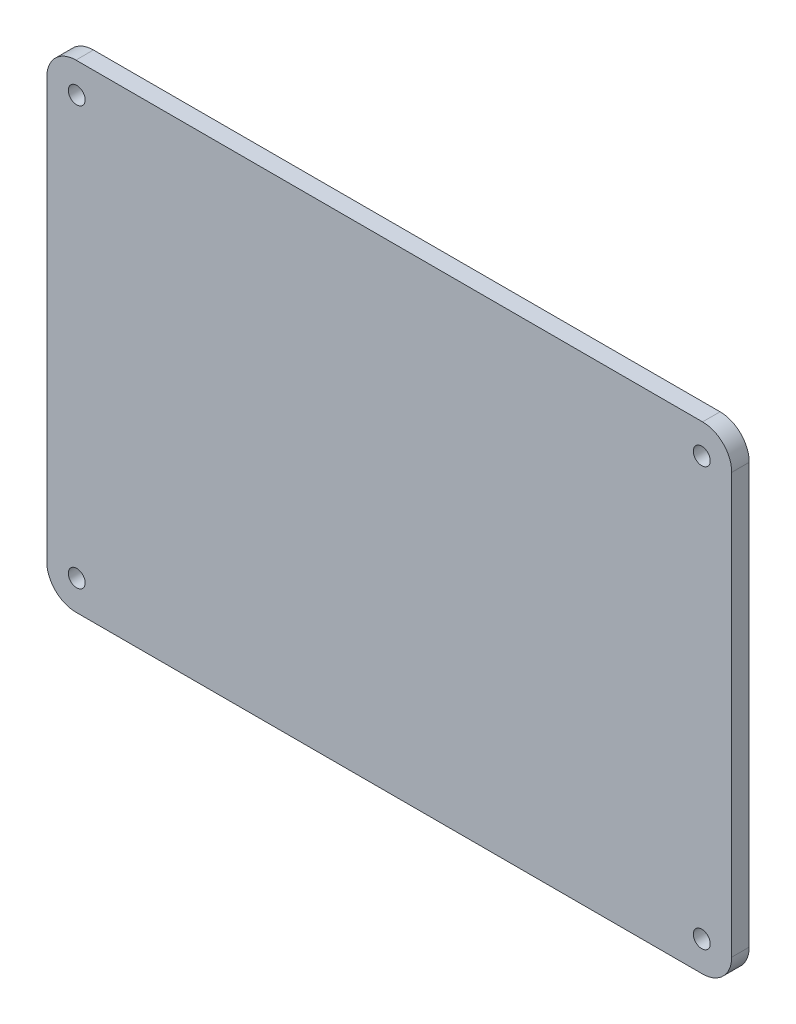
ISO-10303-21;
HEADER;
FILE_DESCRIPTION(('STEP AP214'),'2;1');
FILE_NAME('part.step','',(''),(''),'','','');
FILE_SCHEMA(('AUTOMOTIVE_DESIGN { 1 0 10303 214 1 1 1 1 }'));
ENDSEC;
DATA;
#1=APPLICATION_CONTEXT('core data for automotive mechanical design processes');
#2=APPLICATION_PROTOCOL_DEFINITION('international standard','automotive_design',2000,#1);
#3=PRODUCT_CONTEXT('',#1,'mechanical');
#4=PRODUCT('Part','Part','',(#3));
#5=PRODUCT_RELATED_PRODUCT_CATEGORY('part','',(#4));
#6=PRODUCT_DEFINITION_FORMATION('','',#4);
#7=PRODUCT_DEFINITION_CONTEXT('part definition',#1,'design');
#8=PRODUCT_DEFINITION('design','',#6,#7);
#9=PRODUCT_DEFINITION_SHAPE('','',#8);
#10=(LENGTH_UNIT() NAMED_UNIT(*) SI_UNIT(.MILLI.,.METRE.));
#11=(NAMED_UNIT(*) PLANE_ANGLE_UNIT() SI_UNIT($,.RADIAN.));
#12=(NAMED_UNIT(*) SI_UNIT($,.STERADIAN.) SOLID_ANGLE_UNIT());
#13=UNCERTAINTY_MEASURE_WITH_UNIT(LENGTH_MEASURE(1.E-05),#10,'distance_accuracy_value','');
#14=(GEOMETRIC_REPRESENTATION_CONTEXT(3) GLOBAL_UNCERTAINTY_ASSIGNED_CONTEXT((#13)) GLOBAL_UNIT_ASSIGNED_CONTEXT((#10,
#11,#12)) REPRESENTATION_CONTEXT('',''));
#15=CARTESIAN_POINT('',(0.,0.,0.));
#16=DIRECTION('',(0.,0.,1.));
#17=DIRECTION('',(1.,0.,0.));
#18=AXIS2_PLACEMENT_3D('',#15,#16,#17);
#19=CARTESIAN_POINT('',(-700.529573215545,903.661404474546,3.));
#20=DIRECTION('',(0.,0.,-1.));
#21=DIRECTION('',(-1.,0.,0.));
#22=AXIS2_PLACEMENT_3D('',#19,#20,#21);
#23=CYLINDRICAL_SURFACE('',#22,5.00000000000061);
#24=CARTESIAN_POINT('',(-700.529573215545,903.661404474546,0.));
#25=DIRECTION('',(0.,0.,1.));
#26=DIRECTION('',(1.,0.,0.));
#27=AXIS2_PLACEMENT_3D('',#24,#25,#26);
#28=CIRCLE('',#27,5.00000000000061);
#29=CARTESIAN_POINT('',(-700.529573215546,908.661404474546,0.));
#30=VERTEX_POINT('',#29);
#31=CARTESIAN_POINT('',(-705.529573215546,903.661404474546,0.));
#32=VERTEX_POINT('',#31);
#33=EDGE_CURVE('E135',#30,#32,#28,.T.);
#34=ORIENTED_EDGE('',*,*,#33,.T.);
#35=DIRECTION('',(0.,0.,-1.));
#36=VECTOR('',#35,1.);
#37=CARTESIAN_POINT('',(-705.529573215546,903.661404474546,3.));
#38=LINE('',#37,#36);
#39=CARTESIAN_POINT('',(-705.529573215546,903.661404474546,3.));
#40=VERTEX_POINT('',#39);
#41=EDGE_CURVE('E11',#40,#32,#38,.T.);
#42=ORIENTED_EDGE('',*,*,#41,.F.);
#43=CARTESIAN_POINT('',(-700.529573215545,903.661404474546,3.));
#44=DIRECTION('',(0.,0.,1.));
#45=DIRECTION('',(1.,0.,0.));
#46=AXIS2_PLACEMENT_3D('',#43,#44,#45);
#47=CIRCLE('',#46,5.00000000000061);
#48=CARTESIAN_POINT('',(-700.529573215546,908.661404474546,3.));
#49=VERTEX_POINT('',#48);
#50=EDGE_CURVE('E150',#49,#40,#47,.T.);
#51=ORIENTED_EDGE('',*,*,#50,.F.);
#52=DIRECTION('',(0.,0.,-1.));
#53=VECTOR('',#52,1.);
#54=CARTESIAN_POINT('',(-700.529573215546,908.661404474546,3.));
#55=LINE('',#54,#53);
#56=EDGE_CURVE('E131',#49,#30,#55,.T.);
#57=ORIENTED_EDGE('',*,*,#56,.T.);
#58=EDGE_LOOP('',(#34,#42,#51,#57));
#59=FACE_BOUND('',#58,.T.);
#60=ADVANCED_FACE('F39',(#59),#23,.T.);
#61=CARTESIAN_POINT('',(-705.529573215546,831.660004474546,3.));
#62=DIRECTION('',(1.,0.,0.));
#63=DIRECTION('',(0.,0.,-1.));
#64=AXIS2_PLACEMENT_3D('',#61,#62,#63);
#65=PLANE('',#64);
#66=DIRECTION('',(0.,-1.,0.));
#67=VECTOR('',#66,1.);
#68=CARTESIAN_POINT('',(-705.529573215546,831.660004474546,0.));
#69=LINE('',#68,#67);
#70=CARTESIAN_POINT('',(-705.529573215546,831.660004474546,0.));
#71=VERTEX_POINT('',#70);
#72=EDGE_CURVE('E138',#32,#71,#69,.T.);
#73=ORIENTED_EDGE('',*,*,#72,.T.);
#74=DIRECTION('',(0.,0.,-1.));
#75=VECTOR('',#74,1.);
#76=CARTESIAN_POINT('',(-705.529573215546,831.660004474546,3.));
#77=LINE('',#76,#75);
#78=CARTESIAN_POINT('',(-705.529573215546,831.660004474546,3.));
#79=VERTEX_POINT('',#78);
#80=EDGE_CURVE('E47',#79,#71,#77,.T.);
#81=ORIENTED_EDGE('',*,*,#80,.F.);
#82=DIRECTION('',(0.,-1.,0.));
#83=VECTOR('',#82,1.);
#84=CARTESIAN_POINT('',(-705.529573215546,831.660004474546,3.));
#85=LINE('',#84,#83);
#86=EDGE_CURVE('E98',#40,#79,#85,.T.);
#87=ORIENTED_EDGE('',*,*,#86,.F.);
#88=ORIENTED_EDGE('',*,*,#41,.T.);
#89=EDGE_LOOP('',(#73,#81,#87,#88));
#90=FACE_BOUND('',#89,.T.);
#91=ADVANCED_FACE('F235',(#90),#65,.F.);
#92=CARTESIAN_POINT('',(-700.529573215546,831.660004474546,3.));
#93=DIRECTION('',(0.,0.,-1.));
#94=DIRECTION('',(-1.,0.,0.));
#95=AXIS2_PLACEMENT_3D('',#92,#93,#94);
#96=CYLINDRICAL_SURFACE('',#95,4.99999999999978);
#97=CARTESIAN_POINT('',(-700.529573215546,831.660004474546,0.));
#98=DIRECTION('',(0.,0.,1.));
#99=DIRECTION('',(1.,0.,0.));
#100=AXIS2_PLACEMENT_3D('',#97,#98,#99);
#101=CIRCLE('',#100,4.99999999999978);
#102=CARTESIAN_POINT('',(-700.529573215546,826.660004474546,0.));
#103=VERTEX_POINT('',#102);
#104=EDGE_CURVE('E141',#71,#103,#101,.T.);
#105=ORIENTED_EDGE('',*,*,#104,.T.);
#106=DIRECTION('',(0.,0.,-1.));
#107=VECTOR('',#106,1.);
#108=CARTESIAN_POINT('',(-700.529573215546,826.660004474546,3.));
#109=LINE('',#108,#107);
#110=CARTESIAN_POINT('',(-700.529573215546,826.660004474546,3.));
#111=VERTEX_POINT('',#110);
#112=EDGE_CURVE('E157',#111,#103,#109,.T.);
#113=ORIENTED_EDGE('',*,*,#112,.F.);
#114=CARTESIAN_POINT('',(-700.529573215546,831.660004474546,3.));
#115=DIRECTION('',(0.,0.,1.));
#116=DIRECTION('',(1.,0.,0.));
#117=AXIS2_PLACEMENT_3D('',#114,#115,#116);
#118=CIRCLE('',#117,4.99999999999978);
#119=EDGE_CURVE('E165',#79,#111,#118,.T.);
#120=ORIENTED_EDGE('',*,*,#119,.F.);
#121=ORIENTED_EDGE('',*,*,#80,.T.);
#122=EDGE_LOOP('',(#105,#113,#120,#121));
#123=FACE_BOUND('',#122,.T.);
#124=ADVANCED_FACE('F163',(#123),#96,.T.);
#125=CARTESIAN_POINT('',(-700.529573215546,826.660004474546,3.));
#126=DIRECTION('',(0.,1.,0.));
#127=DIRECTION('',(-1.,0.,0.));
#128=AXIS2_PLACEMENT_3D('',#125,#126,#127);
#129=PLANE('',#128);
#130=DIRECTION('',(1.,0.,0.));
#131=VECTOR('',#130,1.);
#132=CARTESIAN_POINT('',(-700.529573215546,826.660004474546,0.));
#133=LINE('',#132,#131);
#134=CARTESIAN_POINT('',(-593.069773215546,826.660004474546,0.));
#135=VERTEX_POINT('',#134);
#136=EDGE_CURVE('E143',#103,#135,#133,.T.);
#137=ORIENTED_EDGE('',*,*,#136,.T.);
#138=DIRECTION('',(0.,0.,-1.));
#139=VECTOR('',#138,1.);
#140=CARTESIAN_POINT('',(-593.069773215546,826.660004474546,3.));
#141=LINE('',#140,#139);
#142=CARTESIAN_POINT('',(-593.069773215546,826.660004474546,3.));
#143=VERTEX_POINT('',#142);
#144=EDGE_CURVE('E154',#143,#135,#141,.T.);
#145=ORIENTED_EDGE('',*,*,#144,.F.);
#146=DIRECTION('',(1.,0.,0.));
#147=VECTOR('',#146,1.);
#148=CARTESIAN_POINT('',(-700.529573215546,826.660004474546,3.));
#149=LINE('',#148,#147);
#150=EDGE_CURVE('E177',#111,#143,#149,.T.);
#151=ORIENTED_EDGE('',*,*,#150,.F.);
#152=ORIENTED_EDGE('',*,*,#112,.T.);
#153=EDGE_LOOP('',(#137,#145,#151,#152));
#154=FACE_BOUND('',#153,.T.);
#155=ADVANCED_FACE('F173',(#154),#129,.F.);
#156=CARTESIAN_POINT('',(-593.069773215546,831.660004474546,3.));
#157=DIRECTION('',(0.,0.,-1.));
#158=DIRECTION('',(-1.,0.,0.));
#159=AXIS2_PLACEMENT_3D('',#156,#157,#158);
#160=CYLINDRICAL_SURFACE('',#159,4.99999999999967);
#161=CARTESIAN_POINT('',(-593.069773215546,831.660004474546,0.));
#162=DIRECTION('',(0.,0.,1.));
#163=DIRECTION('',(-1.,0.,0.));
#164=AXIS2_PLACEMENT_3D('',#161,#162,#163);
#165=CIRCLE('',#164,4.99999999999967);
#166=CARTESIAN_POINT('',(-588.069773215546,831.660004474546,0.));
#167=VERTEX_POINT('',#166);
#168=EDGE_CURVE('E145',#135,#167,#165,.T.);
#169=ORIENTED_EDGE('',*,*,#168,.T.);
#170=DIRECTION('',(0.,0.,-1.));
#171=VECTOR('',#170,1.);
#172=CARTESIAN_POINT('',(-588.069773215546,831.660004474546,3.));
#173=LINE('',#172,#171);
#174=CARTESIAN_POINT('',(-588.069773215546,831.660004474546,3.));
#175=VERTEX_POINT('',#174);
#176=EDGE_CURVE('E126',#175,#167,#173,.T.);
#177=ORIENTED_EDGE('',*,*,#176,.F.);
#178=CARTESIAN_POINT('',(-593.069773215546,831.660004474546,3.));
#179=DIRECTION('',(0.,0.,1.));
#180=DIRECTION('',(-1.,0.,0.));
#181=AXIS2_PLACEMENT_3D('',#178,#179,#180);
#182=CIRCLE('',#181,4.99999999999967);
#183=EDGE_CURVE('E117',#143,#175,#182,.T.);
#184=ORIENTED_EDGE('',*,*,#183,.F.);
#185=ORIENTED_EDGE('',*,*,#144,.T.);
#186=EDGE_LOOP('',(#169,#177,#184,#185));
#187=FACE_BOUND('',#186,.T.);
#188=ADVANCED_FACE('F176',(#187),#160,.T.);
#189=CARTESIAN_POINT('',(-588.069773215546,903.661404474546,3.));
#190=DIRECTION('',(-1.,0.,0.));
#191=DIRECTION('',(0.,0.,1.));
#192=AXIS2_PLACEMENT_3D('',#189,#190,#191);
#193=PLANE('',#192);
#194=DIRECTION('',(0.,1.,0.));
#195=VECTOR('',#194,1.);
#196=CARTESIAN_POINT('',(-588.069773215546,903.661404474546,0.));
#197=LINE('',#196,#195);
#198=CARTESIAN_POINT('',(-588.069773215546,903.661404474546,0.));
#199=VERTEX_POINT('',#198);
#200=EDGE_CURVE('E125',#167,#199,#197,.T.);
#201=ORIENTED_EDGE('',*,*,#200,.T.);
#202=DIRECTION('',(0.,0.,-1.));
#203=VECTOR('',#202,1.);
#204=CARTESIAN_POINT('',(-588.069773215546,903.661404474546,3.));
#205=LINE('',#204,#203);
#206=CARTESIAN_POINT('',(-588.069773215546,903.661404474546,3.));
#207=VERTEX_POINT('',#206);
#208=EDGE_CURVE('E122',#207,#199,#205,.T.);
#209=ORIENTED_EDGE('',*,*,#208,.F.);
#210=DIRECTION('',(0.,1.,0.));
#211=VECTOR('',#210,1.);
#212=CARTESIAN_POINT('',(-588.069773215546,903.661404474546,3.));
#213=LINE('',#212,#211);
#214=EDGE_CURVE('E111',#175,#207,#213,.T.);
#215=ORIENTED_EDGE('',*,*,#214,.F.);
#216=ORIENTED_EDGE('',*,*,#176,.T.);
#217=EDGE_LOOP('',(#201,#209,#215,#216));
#218=FACE_BOUND('',#217,.T.);
#219=ADVANCED_FACE('F123',(#218),#193,.F.);
#220=CARTESIAN_POINT('',(-593.069773215546,903.661404474546,3.));
#221=DIRECTION('',(0.,0.,-1.));
#222=DIRECTION('',(-1.,0.,0.));
#223=AXIS2_PLACEMENT_3D('',#220,#221,#222);
#224=CYLINDRICAL_SURFACE('',#223,5.00000000000039);
#225=CARTESIAN_POINT('',(-593.069773215546,903.661404474546,0.));
#226=DIRECTION('',(0.,0.,1.));
#227=DIRECTION('',(-1.,0.,0.));
#228=AXIS2_PLACEMENT_3D('',#225,#226,#227);
#229=CIRCLE('',#228,5.00000000000039);
#230=CARTESIAN_POINT('',(-593.069773215546,908.661404474546,0.));
#231=VERTEX_POINT('',#230);
#232=EDGE_CURVE('E84',#199,#231,#229,.T.);
#233=ORIENTED_EDGE('',*,*,#232,.T.);
#234=DIRECTION('',(0.,0.,-1.));
#235=VECTOR('',#234,1.);
#236=CARTESIAN_POINT('',(-593.069773215546,908.661404474546,3.));
#237=LINE('',#236,#235);
#238=CARTESIAN_POINT('',(-593.069773215546,908.661404474546,3.));
#239=VERTEX_POINT('',#238);
#240=EDGE_CURVE('E127',#239,#231,#237,.T.);
#241=ORIENTED_EDGE('',*,*,#240,.F.);
#242=CARTESIAN_POINT('',(-593.069773215546,903.661404474546,3.));
#243=DIRECTION('',(0.,0.,1.));
#244=DIRECTION('',(-1.,0.,0.));
#245=AXIS2_PLACEMENT_3D('',#242,#243,#244);
#246=CIRCLE('',#245,5.00000000000039);
#247=EDGE_CURVE('E115',#207,#239,#246,.T.);
#248=ORIENTED_EDGE('',*,*,#247,.F.);
#249=ORIENTED_EDGE('',*,*,#208,.T.);
#250=EDGE_LOOP('',(#233,#241,#248,#249));
#251=FACE_BOUND('',#250,.T.);
#252=ADVANCED_FACE('F129',(#251),#224,.T.);
#253=CARTESIAN_POINT('',(-700.529573215546,908.661404474546,3.));
#254=DIRECTION('',(0.,-1.,0.));
#255=DIRECTION('',(1.,0.,0.));
#256=AXIS2_PLACEMENT_3D('',#253,#254,#255);
#257=PLANE('',#256);
#258=DIRECTION('',(-1.,0.,0.));
#259=VECTOR('',#258,1.);
#260=CARTESIAN_POINT('',(-700.529573215546,908.661404474546,0.));
#261=LINE('',#260,#259);
#262=EDGE_CURVE('E90',#231,#30,#261,.T.);
#263=ORIENTED_EDGE('',*,*,#262,.T.);
#264=ORIENTED_EDGE('',*,*,#56,.F.);
#265=DIRECTION('',(-1.,0.,0.));
#266=VECTOR('',#265,1.);
#267=CARTESIAN_POINT('',(-700.529573215546,908.661404474546,3.));
#268=LINE('',#267,#266);
#269=EDGE_CURVE('E55',#239,#49,#268,.T.);
#270=ORIENTED_EDGE('',*,*,#269,.F.);
#271=ORIENTED_EDGE('',*,*,#240,.T.);
#272=EDGE_LOOP('',(#263,#264,#270,#271));
#273=FACE_BOUND('',#272,.T.);
#274=ADVANCED_FACE('F211',(#273),#257,.F.);
#275=CARTESIAN_POINT('',(-700.529573215545,903.661404474546,3.));
#276=DIRECTION('',(0.,0.,1.));
#277=DIRECTION('',(1.,0.,0.));
#278=AXIS2_PLACEMENT_3D('',#275,#276,#277);
#279=PLANE('',#278);
#280=CARTESIAN_POINT('',(-700.393534246225,903.525365505225,3.));
#281=DIRECTION('',(0.,0.,1.));
#282=DIRECTION('',(1.,0.,0.));
#283=AXIS2_PLACEMENT_3D('',#280,#281,#282);
#284=CIRCLE('',#283,1.44999999999995);
#285=CARTESIAN_POINT('',(-698.943534246225,903.525365505225,3.));
#286=VERTEX_POINT('',#285);
#287=EDGE_CURVE('E203',#286,#286,#284,.T.);
#288=ORIENTED_EDGE('',*,*,#287,.F.);
#289=EDGE_LOOP('',(#288));
#290=FACE_BOUND('',#289,.T.);
#291=CARTESIAN_POINT('',(-593.205812184867,903.525365505225,3.));
#292=DIRECTION('',(0.,0.,1.));
#293=DIRECTION('',(1.,0.,0.));
#294=AXIS2_PLACEMENT_3D('',#291,#292,#293);
#295=CIRCLE('',#294,1.44999999999995);
#296=CARTESIAN_POINT('',(-591.755812184867,903.525365505225,3.));
#297=VERTEX_POINT('',#296);
#298=EDGE_CURVE('E197',#297,#297,#295,.T.);
#299=ORIENTED_EDGE('',*,*,#298,.F.);
#300=EDGE_LOOP('',(#299));
#301=FACE_BOUND('',#300,.T.);
#302=CARTESIAN_POINT('',(-593.205812184867,831.796043443867,3.));
#303=DIRECTION('',(0.,0.,1.));
#304=DIRECTION('',(1.,0.,0.));
#305=AXIS2_PLACEMENT_3D('',#302,#303,#304);
#306=CIRCLE('',#305,1.44999999999995);
#307=CARTESIAN_POINT('',(-591.755812184867,831.796043443867,3.));
#308=VERTEX_POINT('',#307);
#309=EDGE_CURVE('E191',#308,#308,#306,.T.);
#310=ORIENTED_EDGE('',*,*,#309,.F.);
#311=EDGE_LOOP('',(#310));
#312=FACE_BOUND('',#311,.T.);
#313=CARTESIAN_POINT('',(-700.393534246225,831.796043443867,3.));
#314=DIRECTION('',(0.,0.,1.));
#315=DIRECTION('',(1.,0.,0.));
#316=AXIS2_PLACEMENT_3D('',#313,#314,#315);
#317=CIRCLE('',#316,1.44999999999995);
#318=CARTESIAN_POINT('',(-698.943534246225,831.796043443867,3.));
#319=VERTEX_POINT('',#318);
#320=EDGE_CURVE('E185',#319,#319,#317,.T.);
#321=ORIENTED_EDGE('',*,*,#320,.F.);
#322=EDGE_LOOP('',(#321));
#323=FACE_BOUND('',#322,.T.);
#324=ORIENTED_EDGE('',*,*,#50,.T.);
#325=ORIENTED_EDGE('',*,*,#86,.T.);
#326=ORIENTED_EDGE('',*,*,#119,.T.);
#327=ORIENTED_EDGE('',*,*,#150,.T.);
#328=ORIENTED_EDGE('',*,*,#183,.T.);
#329=ORIENTED_EDGE('',*,*,#214,.T.);
#330=ORIENTED_EDGE('',*,*,#247,.T.);
#331=ORIENTED_EDGE('',*,*,#269,.T.);
#332=EDGE_LOOP('',(#324,#325,#326,#327,#328,#329,#330,#331));
#333=FACE_BOUND('',#332,.T.);
#334=ADVANCED_FACE('F113',(#290,#301,#312,#323,#333),#279,.T.);
#335=CARTESIAN_POINT('',(-700.529573215545,903.661404474546,0.));
#336=DIRECTION('',(0.,0.,1.));
#337=DIRECTION('',(1.,0.,0.));
#338=AXIS2_PLACEMENT_3D('',#335,#336,#337);
#339=PLANE('',#338);
#340=CARTESIAN_POINT('',(-700.393534246225,903.525365505225,0.));
#341=DIRECTION('',(0.,0.,1.));
#342=DIRECTION('',(1.,0.,0.));
#343=AXIS2_PLACEMENT_3D('',#340,#341,#342);
#344=CIRCLE('',#343,1.44999999999995);
#345=CARTESIAN_POINT('',(-698.943534246225,903.525365505225,0.));
#346=VERTEX_POINT('',#345);
#347=EDGE_CURVE('E200',#346,#346,#344,.T.);
#348=ORIENTED_EDGE('',*,*,#347,.T.);
#349=EDGE_LOOP('',(#348));
#350=FACE_BOUND('',#349,.T.);
#351=CARTESIAN_POINT('',(-593.205812184867,903.525365505225,0.));
#352=DIRECTION('',(0.,0.,1.));
#353=DIRECTION('',(1.,0.,0.));
#354=AXIS2_PLACEMENT_3D('',#351,#352,#353);
#355=CIRCLE('',#354,1.44999999999995);
#356=CARTESIAN_POINT('',(-591.755812184867,903.525365505225,0.));
#357=VERTEX_POINT('',#356);
#358=EDGE_CURVE('E194',#357,#357,#355,.T.);
#359=ORIENTED_EDGE('',*,*,#358,.T.);
#360=EDGE_LOOP('',(#359));
#361=FACE_BOUND('',#360,.T.);
#362=CARTESIAN_POINT('',(-593.205812184867,831.796043443867,0.));
#363=DIRECTION('',(0.,0.,1.));
#364=DIRECTION('',(1.,0.,0.));
#365=AXIS2_PLACEMENT_3D('',#362,#363,#364);
#366=CIRCLE('',#365,1.44999999999995);
#367=CARTESIAN_POINT('',(-591.755812184867,831.796043443867,0.));
#368=VERTEX_POINT('',#367);
#369=EDGE_CURVE('E188',#368,#368,#366,.T.);
#370=ORIENTED_EDGE('',*,*,#369,.T.);
#371=EDGE_LOOP('',(#370));
#372=FACE_BOUND('',#371,.T.);
#373=CARTESIAN_POINT('',(-700.393534246225,831.796043443867,0.));
#374=DIRECTION('',(0.,0.,1.));
#375=DIRECTION('',(1.,0.,0.));
#376=AXIS2_PLACEMENT_3D('',#373,#374,#375);
#377=CIRCLE('',#376,1.44999999999995);
#378=CARTESIAN_POINT('',(-698.943534246225,831.796043443867,0.));
#379=VERTEX_POINT('',#378);
#380=EDGE_CURVE('E139',#379,#379,#377,.T.);
#381=ORIENTED_EDGE('',*,*,#380,.T.);
#382=EDGE_LOOP('',(#381));
#383=FACE_BOUND('',#382,.T.);
#384=ORIENTED_EDGE('',*,*,#33,.F.);
#385=ORIENTED_EDGE('',*,*,#262,.F.);
#386=ORIENTED_EDGE('',*,*,#232,.F.);
#387=ORIENTED_EDGE('',*,*,#200,.F.);
#388=ORIENTED_EDGE('',*,*,#168,.F.);
#389=ORIENTED_EDGE('',*,*,#136,.F.);
#390=ORIENTED_EDGE('',*,*,#104,.F.);
#391=ORIENTED_EDGE('',*,*,#72,.F.);
#392=EDGE_LOOP('',(#384,#385,#386,#387,#388,#389,#390,#391));
#393=FACE_BOUND('',#392,.T.);
#394=ADVANCED_FACE('F169',(#350,#361,#372,#383,#393),#339,.F.);
#395=CARTESIAN_POINT('',(-700.393534246225,831.796043443867,3.));
#396=DIRECTION('',(0.,0.,1.));
#397=DIRECTION('',(1.,0.,0.));
#398=AXIS2_PLACEMENT_3D('',#395,#396,#397);
#399=CYLINDRICAL_SURFACE('',#398,1.44999999999995);
#400=ORIENTED_EDGE('',*,*,#380,.F.);
#401=EDGE_LOOP('',(#400));
#402=FACE_BOUND('',#401,.T.);
#403=ORIENTED_EDGE('',*,*,#320,.T.);
#404=EDGE_LOOP('',(#403));
#405=FACE_BOUND('',#404,.T.);
#406=ADVANCED_FACE('F219',(#402,#405),#399,.F.);
#407=CARTESIAN_POINT('',(-593.205812184867,831.796043443867,3.));
#408=DIRECTION('',(0.,0.,1.));
#409=DIRECTION('',(1.,0.,0.));
#410=AXIS2_PLACEMENT_3D('',#407,#408,#409);
#411=CYLINDRICAL_SURFACE('',#410,1.44999999999995);
#412=ORIENTED_EDGE('',*,*,#369,.F.);
#413=EDGE_LOOP('',(#412));
#414=FACE_BOUND('',#413,.T.);
#415=ORIENTED_EDGE('',*,*,#309,.T.);
#416=EDGE_LOOP('',(#415));
#417=FACE_BOUND('',#416,.T.);
#418=ADVANCED_FACE('F221',(#414,#417),#411,.F.);
#419=CARTESIAN_POINT('',(-593.205812184867,903.525365505225,3.));
#420=DIRECTION('',(0.,0.,1.));
#421=DIRECTION('',(1.,0.,0.));
#422=AXIS2_PLACEMENT_3D('',#419,#420,#421);
#423=CYLINDRICAL_SURFACE('',#422,1.44999999999995);
#424=ORIENTED_EDGE('',*,*,#358,.F.);
#425=EDGE_LOOP('',(#424));
#426=FACE_BOUND('',#425,.T.);
#427=ORIENTED_EDGE('',*,*,#298,.T.);
#428=EDGE_LOOP('',(#427));
#429=FACE_BOUND('',#428,.T.);
#430=ADVANCED_FACE('F228',(#426,#429),#423,.F.);
#431=CARTESIAN_POINT('',(-700.393534246225,903.525365505225,3.));
#432=DIRECTION('',(0.,0.,1.));
#433=DIRECTION('',(1.,0.,0.));
#434=AXIS2_PLACEMENT_3D('',#431,#432,#433);
#435=CYLINDRICAL_SURFACE('',#434,1.44999999999995);
#436=ORIENTED_EDGE('',*,*,#347,.F.);
#437=EDGE_LOOP('',(#436));
#438=FACE_BOUND('',#437,.T.);
#439=ORIENTED_EDGE('',*,*,#287,.T.);
#440=EDGE_LOOP('',(#439));
#441=FACE_BOUND('',#440,.T.);
#442=ADVANCED_FACE('F207',(#438,#441),#435,.F.);
#443=CLOSED_SHELL('',(#60,#91,#124,#155,#188,#219,#252,#274,#334,#394,#406,#418,#430,#442));
#444=MANIFOLD_SOLID_BREP('B2',#443);
#445=ADVANCED_BREP_SHAPE_REPRESENTATION('',(#18,#444),#14);
#446=SHAPE_DEFINITION_REPRESENTATION(#9,#445);
ENDSEC;
END-ISO-10303-21;
